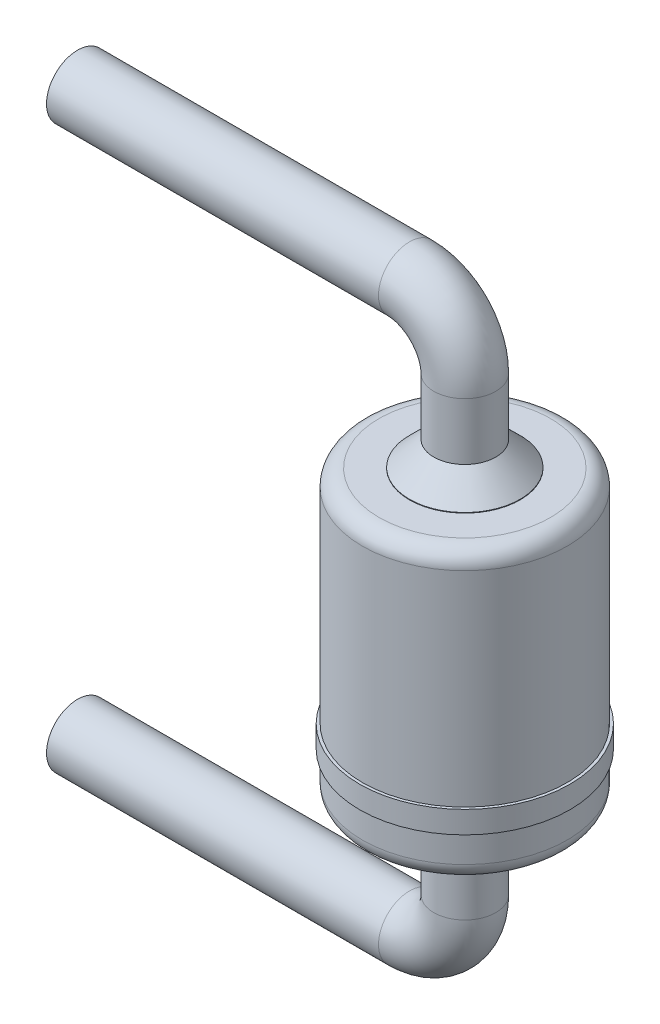
ISO-10303-21;
HEADER;
FILE_DESCRIPTION(('STEP AP214'),'2;1');
FILE_NAME('part.step','',(''),(''),'','','');
FILE_SCHEMA(('AUTOMOTIVE_DESIGN { 1 0 10303 214 1 1 1 1 }'));
ENDSEC;
DATA;
#1=APPLICATION_CONTEXT('core data for automotive mechanical design processes');
#2=APPLICATION_PROTOCOL_DEFINITION('international standard','automotive_design',2000,#1);
#3=PRODUCT_CONTEXT('',#1,'mechanical');
#4=PRODUCT('Part','Part','',(#3));
#5=PRODUCT_RELATED_PRODUCT_CATEGORY('part','',(#4));
#6=PRODUCT_DEFINITION_FORMATION('','',#4);
#7=PRODUCT_DEFINITION_CONTEXT('part definition',#1,'design');
#8=PRODUCT_DEFINITION('design','',#6,#7);
#9=PRODUCT_DEFINITION_SHAPE('','',#8);
#10=(LENGTH_UNIT() NAMED_UNIT(*) SI_UNIT(.MILLI.,.METRE.));
#11=(NAMED_UNIT(*) PLANE_ANGLE_UNIT() SI_UNIT($,.RADIAN.));
#12=(NAMED_UNIT(*) SI_UNIT($,.STERADIAN.) SOLID_ANGLE_UNIT());
#13=UNCERTAINTY_MEASURE_WITH_UNIT(LENGTH_MEASURE(1.E-05),#10,'distance_accuracy_value','');
#14=(GEOMETRIC_REPRESENTATION_CONTEXT(3) GLOBAL_UNCERTAINTY_ASSIGNED_CONTEXT((#13)) GLOBAL_UNIT_ASSIGNED_CONTEXT((#10,
#11,#12)) REPRESENTATION_CONTEXT('',''));
#15=CARTESIAN_POINT('',(0.,0.,0.));
#16=DIRECTION('',(0.,0.,1.));
#17=DIRECTION('',(1.,0.,0.));
#18=AXIS2_PLACEMENT_3D('',#15,#16,#17);
#19=CARTESIAN_POINT('',(0.,0.4,0.));
#20=DIRECTION('',(0.,1.,0.));
#21=DIRECTION('',(0.,0.,1.));
#22=AXIS2_PLACEMENT_3D('',#19,#20,#21);
#23=CYLINDRICAL_SURFACE('',#22,0.95);
#24=CARTESIAN_POINT('',(0.,0.4,0.));
#25=DIRECTION('',(0.,1.,0.));
#26=DIRECTION('',(0.,0.,1.));
#27=AXIS2_PLACEMENT_3D('',#24,#25,#26);
#28=CIRCLE('',#27,0.95);
#29=CARTESIAN_POINT('',(0.,0.4,0.95));
#30=VERTEX_POINT('',#29);
#31=EDGE_CURVE('E11',#30,#30,#28,.T.);
#32=ORIENTED_EDGE('',*,*,#31,.T.);
#33=EDGE_LOOP('',(#32));
#34=FACE_BOUND('',#33,.T.);
#35=CARTESIAN_POINT('',(0.,0.6,0.));
#36=DIRECTION('',(0.,1.,0.));
#37=DIRECTION('',(0.,0.,1.));
#38=AXIS2_PLACEMENT_3D('',#35,#36,#37);
#39=CIRCLE('',#38,0.95);
#40=CARTESIAN_POINT('',(0.,0.6,0.95));
#41=VERTEX_POINT('',#40);
#42=EDGE_CURVE('E49',#41,#41,#39,.T.);
#43=ORIENTED_EDGE('',*,*,#42,.F.);
#44=EDGE_LOOP('',(#43));
#45=FACE_BOUND('',#44,.T.);
#46=ADVANCED_FACE('F46',(#34,#45),#23,.T.);
#47=CARTESIAN_POINT('',(0.,0.4,0.));
#48=DIRECTION('',(0.,1.,0.));
#49=DIRECTION('',(0.,0.,1.));
#50=AXIS2_PLACEMENT_3D('',#47,#48,#49);
#51=PLANE('',#50);
#52=CARTESIAN_POINT('',(0.,0.4,0.));
#53=DIRECTION('',(0.,1.,0.));
#54=DIRECTION('',(0.,0.,1.));
#55=AXIS2_PLACEMENT_3D('',#52,#53,#54);
#56=CIRCLE('',#55,0.9);
#57=CARTESIAN_POINT('',(0.,0.4,0.9));
#58=VERTEX_POINT('',#57);
#59=EDGE_CURVE('E56',#58,#58,#56,.T.);
#60=ORIENTED_EDGE('',*,*,#59,.T.);
#61=EDGE_LOOP('',(#60));
#62=FACE_BOUND('',#61,.T.);
#63=ORIENTED_EDGE('',*,*,#31,.F.);
#64=EDGE_LOOP('',(#63));
#65=FACE_BOUND('',#64,.T.);
#66=ADVANCED_FACE('F64',(#62,#65),#51,.F.);
#67=CARTESIAN_POINT('',(0.,0.6,0.));
#68=DIRECTION('',(0.,1.,0.));
#69=DIRECTION('',(0.,0.,1.));
#70=AXIS2_PLACEMENT_3D('',#67,#68,#69);
#71=PLANE('',#70);
#72=CARTESIAN_POINT('',(0.,0.6,0.));
#73=DIRECTION('',(0.,1.,0.));
#74=DIRECTION('',(0.,0.,1.));
#75=AXIS2_PLACEMENT_3D('',#72,#73,#74);
#76=CIRCLE('',#75,0.9);
#77=CARTESIAN_POINT('',(0.,0.6,0.9));
#78=VERTEX_POINT('',#77);
#79=EDGE_CURVE('E58',#78,#78,#76,.T.);
#80=ORIENTED_EDGE('',*,*,#79,.F.);
#81=EDGE_LOOP('',(#80));
#82=FACE_BOUND('',#81,.T.);
#83=ORIENTED_EDGE('',*,*,#42,.T.);
#84=EDGE_LOOP('',(#83));
#85=FACE_BOUND('',#84,.T.);
#86=ADVANCED_FACE('F70',(#82,#85),#71,.T.);
#87=CARTESIAN_POINT('',(0.,0.4,0.));
#88=DIRECTION('',(0.,1.,0.));
#89=DIRECTION('',(0.,0.,1.));
#90=AXIS2_PLACEMENT_3D('',#87,#88,#89);
#91=CYLINDRICAL_SURFACE('',#90,0.9);
#92=ORIENTED_EDGE('',*,*,#59,.F.);
#93=EDGE_LOOP('',(#92));
#94=FACE_BOUND('',#93,.T.);
#95=ORIENTED_EDGE('',*,*,#79,.T.);
#96=EDGE_LOOP('',(#95));
#97=FACE_BOUND('',#96,.T.);
#98=ADVANCED_FACE('F67',(#94,#97),#91,.F.);
#99=CLOSED_SHELL('',(#46,#66,#86,#98));
#100=MANIFOLD_SOLID_BREP('B2',#99);
#101=CARTESIAN_POINT('',(0.,2.825,0.));
#102=DIRECTION('',(0.,-1.,0.));
#103=DIRECTION('',(0.,0.,-1.));
#104=AXIS2_PLACEMENT_3D('',#101,#102,#103);
#105=CYLINDRICAL_SURFACE('',#104,0.5);
#106=CARTESIAN_POINT('',(0.,2.605,0.));
#107=DIRECTION('',(0.,1.,0.));
#108=DIRECTION('',(0.,0.,1.));
#109=AXIS2_PLACEMENT_3D('',#106,#107,#108);
#110=CIRCLE('',#109,0.5);
#111=CARTESIAN_POINT('',(0.,2.605,0.5));
#112=VERTEX_POINT('',#111);
#113=EDGE_CURVE('E45',#112,#112,#110,.F.);
#114=ORIENTED_EDGE('',*,*,#113,.T.);
#115=EDGE_LOOP('',(#114));
#116=FACE_BOUND('',#115,.T.);
#117=CARTESIAN_POINT('',(0.,2.6,0.));
#118=DIRECTION('',(0.,1.,0.));
#119=DIRECTION('',(0.,0.,1.));
#120=AXIS2_PLACEMENT_3D('',#117,#118,#119);
#121=CIRCLE('',#120,0.5);
#122=CARTESIAN_POINT('',(0.,2.6,0.5));
#123=VERTEX_POINT('',#122);
#124=EDGE_CURVE('E126',#123,#123,#121,.T.);
#125=ORIENTED_EDGE('',*,*,#124,.T.);
#126=EDGE_LOOP('',(#125));
#127=FACE_BOUND('',#126,.T.);
#128=ADVANCED_FACE('F115',(#116,#127),#105,.T.);
#129=CARTESIAN_POINT('',(0.,2.6,0.));
#130=DIRECTION('',(0.,1.,0.));
#131=DIRECTION('',(0.,0.,1.));
#132=AXIS2_PLACEMENT_3D('',#129,#130,#131);
#133=PLANE('',#132);
#134=ORIENTED_EDGE('',*,*,#124,.F.);
#135=EDGE_LOOP('',(#134));
#136=FACE_BOUND('',#135,.T.);
#137=ADVANCED_FACE('F158',(#136),#133,.F.);
#138=CARTESIAN_POINT('',(0.,2.825,0.));
#139=DIRECTION('',(0.,-1.,0.));
#140=DIRECTION('',(0.,0.,-1.));
#141=AXIS2_PLACEMENT_3D('',#138,#139,#140);
#142=CONICAL_SURFACE('',#141,0.28,0.785398163397447);
#143=ORIENTED_EDGE('',*,*,#113,.F.);
#144=EDGE_LOOP('',(#143));
#145=FACE_BOUND('',#144,.T.);
#146=CARTESIAN_POINT('',(0.,2.825,0.));
#147=DIRECTION('',(0.,1.,0.));
#148=DIRECTION('',(0.,0.,1.));
#149=AXIS2_PLACEMENT_3D('',#146,#147,#148);
#150=CIRCLE('',#149,0.28);
#151=CARTESIAN_POINT('',(0.,2.825,0.28));
#152=VERTEX_POINT('',#151);
#153=EDGE_CURVE('E122',#152,#152,#150,.T.);
#154=ORIENTED_EDGE('',*,*,#153,.F.);
#155=EDGE_LOOP('',(#154));
#156=FACE_BOUND('',#155,.T.);
#157=ADVANCED_FACE('F117',(#145,#156),#142,.T.);
#158=CARTESIAN_POINT('',(-3.5,3.84,0.));
#159=DIRECTION('',(-1.,0.,0.));
#160=DIRECTION('',(0.,0.,1.));
#161=AXIS2_PLACEMENT_3D('',#158,#159,#160);
#162=PLANE('',#161);
#163=CARTESIAN_POINT('',(-3.5,3.84,0.));
#164=DIRECTION('',(-1.,0.,0.));
#165=DIRECTION('',(0.,0.,1.));
#166=AXIS2_PLACEMENT_3D('',#163,#164,#165);
#167=CIRCLE('',#166,0.28);
#168=CARTESIAN_POINT('',(-3.5,3.84,0.28));
#169=VERTEX_POINT('',#168);
#170=EDGE_CURVE('E130',#169,#169,#167,.T.);
#171=ORIENTED_EDGE('',*,*,#170,.T.);
#172=EDGE_LOOP('',(#171));
#173=FACE_BOUND('',#172,.T.);
#174=ADVANCED_FACE('F146',(#173),#162,.T.);
#175=CARTESIAN_POINT('',(0.,2.825,0.));
#176=DIRECTION('',(0.,1.,0.));
#177=DIRECTION('',(0.,0.,1.));
#178=AXIS2_PLACEMENT_3D('',#175,#176,#177);
#179=CYLINDRICAL_SURFACE('',#178,0.28);
#180=CARTESIAN_POINT('',(0.,3.34,0.));
#181=DIRECTION('',(0.,1.,0.));
#182=DIRECTION('',(0.,0.,1.));
#183=AXIS2_PLACEMENT_3D('',#180,#181,#182);
#184=CIRCLE('',#183,0.28);
#185=CARTESIAN_POINT('',(0.27999999999998,3.33999999999999,0.));
#186=VERTEX_POINT('',#185);
#187=EDGE_CURVE('E138',#186,#186,#184,.T.);
#188=ORIENTED_EDGE('',*,*,#187,.F.);
#189=EDGE_LOOP('',(#188));
#190=FACE_BOUND('',#189,.T.);
#191=ORIENTED_EDGE('',*,*,#153,.T.);
#192=EDGE_LOOP('',(#191));
#193=FACE_BOUND('',#192,.T.);
#194=ADVANCED_FACE('F144',(#190,#193),#179,.T.);
#195=CARTESIAN_POINT('',(-0.5,3.34,0.));
#196=DIRECTION('',(0.,0.,1.));
#197=DIRECTION('',(1.,0.,0.));
#198=AXIS2_PLACEMENT_3D('',#195,#196,#197);
#199=TOROIDAL_SURFACE('',#198,0.49999999999998,0.28);
#200=CARTESIAN_POINT('',(-0.500000000000003,3.84,0.));
#201=DIRECTION('',(-1.,0.,0.));
#202=DIRECTION('',(0.,0.,1.));
#203=AXIS2_PLACEMENT_3D('',#200,#201,#202);
#204=CIRCLE('',#203,0.28);
#205=CARTESIAN_POINT('',(-0.500000000000005,4.11999999999998,0.));
#206=VERTEX_POINT('',#205);
#207=EDGE_CURVE('E135',#206,#206,#204,.T.);
#208=CARTESIAN_POINT('',(-0.5,3.34,0.));
#209=DIRECTION('',(0.,0.,1.));
#210=DIRECTION('',(1.,0.,0.));
#211=AXIS2_PLACEMENT_3D('',#208,#209,#210);
#212=CIRCLE('',#211,0.77999999999998);
#213=EDGE_CURVE('',#186,#206,#212,.T.);
#214=ORIENTED_EDGE('',*,*,#187,.T.);
#215=ORIENTED_EDGE('',*,*,#207,.F.);
#216=ORIENTED_EDGE('',*,*,#213,.T.);
#217=ORIENTED_EDGE('',*,*,#213,.F.);
#218=EDGE_LOOP('',(#214,#216,#215,#217));
#219=FACE_BOUND('',#218,.T.);
#220=ADVANCED_FACE('F142',(#219),#199,.T.);
#221=CARTESIAN_POINT('',(-0.500000000000003,3.84,0.));
#222=DIRECTION('',(-1.,0.,0.));
#223=DIRECTION('',(0.,-1.,0.));
#224=AXIS2_PLACEMENT_3D('',#221,#222,#223);
#225=CYLINDRICAL_SURFACE('',#224,0.28);
#226=ORIENTED_EDGE('',*,*,#170,.F.);
#227=EDGE_LOOP('',(#226));
#228=FACE_BOUND('',#227,.T.);
#229=ORIENTED_EDGE('',*,*,#207,.T.);
#230=EDGE_LOOP('',(#229));
#231=FACE_BOUND('',#230,.T.);
#232=ADVANCED_FACE('F152',(#228,#231),#225,.T.);
#233=CLOSED_SHELL('',(#128,#137,#157,#174,#194,#220,#232));
#234=MANIFOLD_SOLID_BREP('B6',#233);
#235=CARTESIAN_POINT('',(0.,2.6,0.));
#236=DIRECTION('',(0.,-1.,0.));
#237=DIRECTION('',(0.,0.,-1.));
#238=AXIS2_PLACEMENT_3D('',#235,#236,#237);
#239=CYLINDRICAL_SURFACE('',#238,0.925000000000002);
#240=CARTESIAN_POINT('',(0.,0.15,0.));
#241=DIRECTION('',(0.,1.,0.));
#242=DIRECTION('',(0.,0.,1.));
#243=AXIS2_PLACEMENT_3D('',#240,#241,#242);
#244=CIRCLE('',#243,0.925000000000002);
#245=CARTESIAN_POINT('',(0.,0.15,0.925000000000002));
#246=VERTEX_POINT('',#245);
#247=EDGE_CURVE('E237',#246,#246,#244,.T.);
#248=ORIENTED_EDGE('',*,*,#247,.T.);
#249=EDGE_LOOP('',(#248));
#250=FACE_BOUND('',#249,.T.);
#251=CARTESIAN_POINT('',(0.,2.45,0.));
#252=DIRECTION('',(0.,1.,0.));
#253=DIRECTION('',(0.,0.,1.));
#254=AXIS2_PLACEMENT_3D('',#251,#252,#253);
#255=CIRCLE('',#254,0.925000000000002);
#256=CARTESIAN_POINT('',(0.,2.45,0.925000000000002));
#257=VERTEX_POINT('',#256);
#258=EDGE_CURVE('E240',#257,#257,#255,.F.);
#259=ORIENTED_EDGE('',*,*,#258,.T.);
#260=EDGE_LOOP('',(#259));
#261=FACE_BOUND('',#260,.T.);
#262=ADVANCED_FACE('F216',(#250,#261),#239,.T.);
#263=CARTESIAN_POINT('',(0.,2.6,0.));
#264=DIRECTION('',(0.,1.,0.));
#265=DIRECTION('',(0.,0.,1.));
#266=AXIS2_PLACEMENT_3D('',#263,#264,#265);
#267=PLANE('',#266);
#268=CARTESIAN_POINT('',(0.,2.6,0.));
#269=DIRECTION('',(0.,1.,0.));
#270=DIRECTION('',(0.,0.,1.));
#271=AXIS2_PLACEMENT_3D('',#268,#269,#270);
#272=CIRCLE('',#271,0.775000000000002);
#273=CARTESIAN_POINT('',(0.,2.6,0.775000000000002));
#274=VERTEX_POINT('',#273);
#275=EDGE_CURVE('E243',#274,#274,#272,.T.);
#276=ORIENTED_EDGE('',*,*,#275,.T.);
#277=EDGE_LOOP('',(#276));
#278=FACE_BOUND('',#277,.T.);
#279=ADVANCED_FACE('F272',(#278),#267,.T.);
#280=CARTESIAN_POINT('',(0.,0.,0.));
#281=DIRECTION('',(0.,1.,0.));
#282=DIRECTION('',(0.,0.,1.));
#283=AXIS2_PLACEMENT_3D('',#280,#281,#282);
#284=PLANE('',#283);
#285=CARTESIAN_POINT('',(0.,0.,0.));
#286=DIRECTION('',(0.,1.,0.));
#287=DIRECTION('',(0.,0.,1.));
#288=AXIS2_PLACEMENT_3D('',#285,#286,#287);
#289=CIRCLE('',#288,0.5);
#290=CARTESIAN_POINT('',(0.,0.,0.5));
#291=VERTEX_POINT('',#290);
#292=EDGE_CURVE('E228',#291,#291,#289,.F.);
#293=ORIENTED_EDGE('',*,*,#292,.F.);
#294=EDGE_LOOP('',(#293));
#295=FACE_BOUND('',#294,.T.);
#296=CARTESIAN_POINT('',(0.,0.,0.));
#297=DIRECTION('',(0.,1.,0.));
#298=DIRECTION('',(0.,0.,1.));
#299=AXIS2_PLACEMENT_3D('',#296,#297,#298);
#300=CIRCLE('',#299,0.775000000000002);
#301=CARTESIAN_POINT('',(0.,0.,0.775000000000002));
#302=VERTEX_POINT('',#301);
#303=EDGE_CURVE('E232',#302,#302,#300,.F.);
#304=ORIENTED_EDGE('',*,*,#303,.T.);
#305=EDGE_LOOP('',(#304));
#306=FACE_BOUND('',#305,.T.);
#307=ADVANCED_FACE('F278',(#295,#306),#284,.F.);
#308=CARTESIAN_POINT('',(0.,2.45,0.));
#309=DIRECTION('',(0.,1.,0.));
#310=DIRECTION('',(0.,0.,1.));
#311=AXIS2_PLACEMENT_3D('',#308,#309,#310);
#312=TOROIDAL_SURFACE('',#311,0.775000000000002,0.15);
#313=ORIENTED_EDGE('',*,*,#258,.F.);
#314=EDGE_LOOP('',(#313));
#315=FACE_BOUND('',#314,.T.);
#316=ORIENTED_EDGE('',*,*,#275,.F.);
#317=EDGE_LOOP('',(#316));
#318=FACE_BOUND('',#317,.T.);
#319=ADVANCED_FACE('F284',(#315,#318),#312,.T.);
#320=CARTESIAN_POINT('',(0.,0.15,0.));
#321=DIRECTION('',(0.,1.,0.));
#322=DIRECTION('',(0.,0.,1.));
#323=AXIS2_PLACEMENT_3D('',#320,#321,#322);
#324=TOROIDAL_SURFACE('',#323,0.775000000000002,0.15);
#325=ORIENTED_EDGE('',*,*,#303,.F.);
#326=EDGE_LOOP('',(#325));
#327=FACE_BOUND('',#326,.T.);
#328=ORIENTED_EDGE('',*,*,#247,.F.);
#329=EDGE_LOOP('',(#328));
#330=FACE_BOUND('',#329,.T.);
#331=ADVANCED_FACE('F286',(#327,#330),#324,.T.);
#332=CARTESIAN_POINT('',(0.,-0.225,0.));
#333=DIRECTION('',(0.,1.,0.));
#334=DIRECTION('',(0.,0.,1.));
#335=AXIS2_PLACEMENT_3D('',#332,#333,#334);
#336=CYLINDRICAL_SURFACE('',#335,0.5);
#337=CARTESIAN_POINT('',(0.,-0.00499999999999939,0.));
#338=DIRECTION('',(0.,-1.,0.));
#339=DIRECTION('',(0.,0.,-1.));
#340=AXIS2_PLACEMENT_3D('',#337,#338,#339);
#341=CIRCLE('',#340,0.5);
#342=CARTESIAN_POINT('',(0.,-0.00499999999999939,-0.5));
#343=VERTEX_POINT('',#342);
#344=EDGE_CURVE('E114',#343,#343,#341,.F.);
#345=ORIENTED_EDGE('',*,*,#344,.T.);
#346=EDGE_LOOP('',(#345));
#347=FACE_BOUND('',#346,.T.);
#348=ORIENTED_EDGE('',*,*,#292,.T.);
#349=EDGE_LOOP('',(#348));
#350=FACE_BOUND('',#349,.T.);
#351=ADVANCED_FACE('F289',(#347,#350),#336,.T.);
#352=CARTESIAN_POINT('',(0.,-0.225,0.));
#353=DIRECTION('',(0.,1.,0.));
#354=DIRECTION('',(0.,0.,1.));
#355=AXIS2_PLACEMENT_3D('',#352,#353,#354);
#356=CONICAL_SURFACE('',#355,0.28,0.785398163397447);
#357=ORIENTED_EDGE('',*,*,#344,.F.);
#358=EDGE_LOOP('',(#357));
#359=FACE_BOUND('',#358,.T.);
#360=CARTESIAN_POINT('',(0.,-0.225,0.));
#361=DIRECTION('',(0.,-1.,0.));
#362=DIRECTION('',(0.,0.,-1.));
#363=AXIS2_PLACEMENT_3D('',#360,#361,#362);
#364=CIRCLE('',#363,0.28);
#365=CARTESIAN_POINT('',(0.,-0.225,-0.28));
#366=VERTEX_POINT('',#365);
#367=EDGE_CURVE('E224',#366,#366,#364,.T.);
#368=ORIENTED_EDGE('',*,*,#367,.F.);
#369=EDGE_LOOP('',(#368));
#370=FACE_BOUND('',#369,.T.);
#371=ADVANCED_FACE('F219',(#359,#370),#356,.T.);
#372=CARTESIAN_POINT('',(-3.5,-1.24,0.));
#373=DIRECTION('',(-1.,0.,0.));
#374=DIRECTION('',(0.,0.,-1.));
#375=AXIS2_PLACEMENT_3D('',#372,#373,#374);
#376=PLANE('',#375);
#377=CARTESIAN_POINT('',(-3.5,-1.24,0.));
#378=DIRECTION('',(-1.,0.,0.));
#379=DIRECTION('',(0.,0.,-1.));
#380=AXIS2_PLACEMENT_3D('',#377,#378,#379);
#381=CIRCLE('',#380,0.28);
#382=CARTESIAN_POINT('',(-3.5,-1.24,-0.28));
#383=VERTEX_POINT('',#382);
#384=EDGE_CURVE('E246',#383,#383,#381,.T.);
#385=ORIENTED_EDGE('',*,*,#384,.T.);
#386=EDGE_LOOP('',(#385));
#387=FACE_BOUND('',#386,.T.);
#388=ADVANCED_FACE('F260',(#387),#376,.T.);
#389=CARTESIAN_POINT('',(0.,-0.225,0.));
#390=DIRECTION('',(0.,-1.,0.));
#391=DIRECTION('',(0.,0.,-1.));
#392=AXIS2_PLACEMENT_3D('',#389,#390,#391);
#393=CYLINDRICAL_SURFACE('',#392,0.28);
#394=CARTESIAN_POINT('',(0.,-0.739999999999997,0.));
#395=DIRECTION('',(0.,-1.,0.));
#396=DIRECTION('',(0.,0.,-1.));
#397=AXIS2_PLACEMENT_3D('',#394,#395,#396);
#398=CIRCLE('',#397,0.28);
#399=CARTESIAN_POINT('',(0.279999999999998,-0.739999999999995,0.));
#400=VERTEX_POINT('',#399);
#401=EDGE_CURVE('E252',#400,#400,#398,.T.);
#402=ORIENTED_EDGE('',*,*,#401,.F.);
#403=EDGE_LOOP('',(#402));
#404=FACE_BOUND('',#403,.T.);
#405=ORIENTED_EDGE('',*,*,#367,.T.);
#406=EDGE_LOOP('',(#405));
#407=FACE_BOUND('',#406,.T.);
#408=ADVANCED_FACE('F258',(#404,#407),#393,.T.);
#409=CARTESIAN_POINT('',(-0.5,-0.74,0.));
#410=DIRECTION('',(0.,0.,-1.));
#411=DIRECTION('',(-1.,0.,0.));
#412=AXIS2_PLACEMENT_3D('',#409,#410,#411);
#413=TOROIDAL_SURFACE('',#412,0.499999999999998,0.28);
#414=CARTESIAN_POINT('',(-0.500000000000003,-1.24,0.));
#415=DIRECTION('',(-1.,0.,0.));
#416=DIRECTION('',(0.,0.,-1.));
#417=AXIS2_PLACEMENT_3D('',#414,#415,#416);
#418=CIRCLE('',#417,0.28);
#419=CARTESIAN_POINT('',(-0.500000000000005,-1.52,0.));
#420=VERTEX_POINT('',#419);
#421=EDGE_CURVE('E249',#420,#420,#418,.T.);
#422=CARTESIAN_POINT('',(-0.5,-0.74,0.));
#423=DIRECTION('',(0.,0.,-1.));
#424=DIRECTION('',(-1.,0.,0.));
#425=AXIS2_PLACEMENT_3D('',#422,#423,#424);
#426=CIRCLE('',#425,0.779999999999998);
#427=EDGE_CURVE('',#400,#420,#426,.T.);
#428=ORIENTED_EDGE('',*,*,#401,.T.);
#429=ORIENTED_EDGE('',*,*,#421,.F.);
#430=ORIENTED_EDGE('',*,*,#427,.T.);
#431=ORIENTED_EDGE('',*,*,#427,.F.);
#432=EDGE_LOOP('',(#428,#430,#429,#431));
#433=FACE_BOUND('',#432,.T.);
#434=ADVANCED_FACE('F256',(#433),#413,.T.);
#435=CARTESIAN_POINT('',(-0.500000000000003,-1.24,0.));
#436=DIRECTION('',(-1.,0.,0.));
#437=DIRECTION('',(0.,-1.,0.));
#438=AXIS2_PLACEMENT_3D('',#435,#436,#437);
#439=CYLINDRICAL_SURFACE('',#438,0.28);
#440=ORIENTED_EDGE('',*,*,#384,.F.);
#441=EDGE_LOOP('',(#440));
#442=FACE_BOUND('',#441,.T.);
#443=ORIENTED_EDGE('',*,*,#421,.T.);
#444=EDGE_LOOP('',(#443));
#445=FACE_BOUND('',#444,.T.);
#446=ADVANCED_FACE('F266',(#442,#445),#439,.T.);
#447=CLOSED_SHELL('',(#262,#279,#307,#319,#331,#351,#371,#388,#408,#434,#446));
#448=MANIFOLD_SOLID_BREP('B40',#447);
#449=ADVANCED_BREP_SHAPE_REPRESENTATION('',(#18,#100,#234,#448),#14);
#450=SHAPE_DEFINITION_REPRESENTATION(#9,#449);
ENDSEC;
END-ISO-10303-21;
